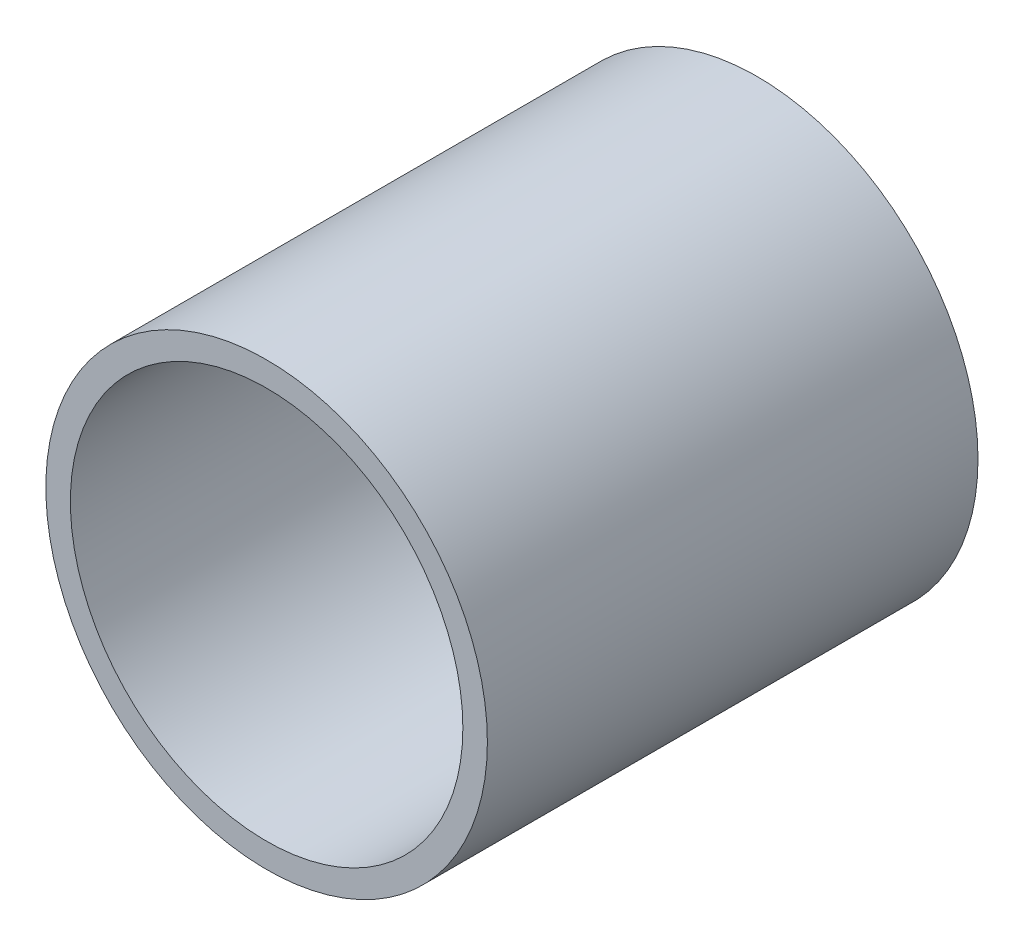
ISO-10303-21;
HEADER;
FILE_DESCRIPTION(('STEP AP214'),'2;1');
FILE_NAME('part.step','',(''),(''),'','','');
FILE_SCHEMA(('AUTOMOTIVE_DESIGN { 1 0 10303 214 1 1 1 1 }'));
ENDSEC;
DATA;
#1=APPLICATION_CONTEXT('core data for automotive mechanical design processes');
#2=APPLICATION_PROTOCOL_DEFINITION('international standard','automotive_design',2000,#1);
#3=PRODUCT_CONTEXT('',#1,'mechanical');
#4=PRODUCT('Part','Part','',(#3));
#5=PRODUCT_RELATED_PRODUCT_CATEGORY('part','',(#4));
#6=PRODUCT_DEFINITION_FORMATION('','',#4);
#7=PRODUCT_DEFINITION_CONTEXT('part definition',#1,'design');
#8=PRODUCT_DEFINITION('design','',#6,#7);
#9=PRODUCT_DEFINITION_SHAPE('','',#8);
#10=(LENGTH_UNIT() NAMED_UNIT(*) SI_UNIT(.MILLI.,.METRE.));
#11=(NAMED_UNIT(*) PLANE_ANGLE_UNIT() SI_UNIT($,.RADIAN.));
#12=(NAMED_UNIT(*) SI_UNIT($,.STERADIAN.) SOLID_ANGLE_UNIT());
#13=UNCERTAINTY_MEASURE_WITH_UNIT(LENGTH_MEASURE(1.E-05),#10,'distance_accuracy_value','');
#14=(GEOMETRIC_REPRESENTATION_CONTEXT(3) GLOBAL_UNCERTAINTY_ASSIGNED_CONTEXT((#13)) GLOBAL_UNIT_ASSIGNED_CONTEXT((#10,
#11,#12)) REPRESENTATION_CONTEXT('',''));
#15=CARTESIAN_POINT('',(0.,0.,0.));
#16=DIRECTION('',(0.,0.,1.));
#17=DIRECTION('',(1.,0.,0.));
#18=AXIS2_PLACEMENT_3D('',#15,#16,#17);
#19=CARTESIAN_POINT('',(0.,0.,40.));
#20=DIRECTION('',(0.,0.,-1.));
#21=DIRECTION('',(-1.,0.,0.));
#22=AXIS2_PLACEMENT_3D('',#19,#20,#21);
#23=CYLINDRICAL_SURFACE('',#22,16.);
#24=CARTESIAN_POINT('',(0.,0.,40.));
#25=DIRECTION('',(0.,0.,1.));
#26=DIRECTION('',(1.,0.,0.));
#27=AXIS2_PLACEMENT_3D('',#24,#25,#26);
#28=CIRCLE('',#27,16.);
#29=CARTESIAN_POINT('',(16.,0.,40.));
#30=VERTEX_POINT('',#29);
#31=EDGE_CURVE('E48',#30,#30,#28,.T.);
#32=ORIENTED_EDGE('',*,*,#31,.T.);
#33=EDGE_LOOP('',(#32));
#34=FACE_BOUND('',#33,.T.);
#35=CARTESIAN_POINT('',(0.,0.,0.));
#36=DIRECTION('',(0.,0.,1.));
#37=DIRECTION('',(1.,0.,0.));
#38=AXIS2_PLACEMENT_3D('',#35,#36,#37);
#39=CIRCLE('',#38,16.);
#40=CARTESIAN_POINT('',(16.,0.,0.));
#41=VERTEX_POINT('',#40);
#42=EDGE_CURVE('E54',#41,#41,#39,.T.);
#43=ORIENTED_EDGE('',*,*,#42,.F.);
#44=EDGE_LOOP('',(#43));
#45=FACE_BOUND('',#44,.T.);
#46=ADVANCED_FACE('F41',(#34,#45),#23,.F.);
#47=CARTESIAN_POINT('',(0.,0.,40.));
#48=DIRECTION('',(0.,0.,-1.));
#49=DIRECTION('',(-1.,0.,0.));
#50=AXIS2_PLACEMENT_3D('',#47,#48,#49);
#51=CYLINDRICAL_SURFACE('',#50,18.);
#52=CARTESIAN_POINT('',(0.,0.,40.));
#53=DIRECTION('',(0.,0.,1.));
#54=DIRECTION('',(1.,0.,0.));
#55=AXIS2_PLACEMENT_3D('',#52,#53,#54);
#56=CIRCLE('',#55,18.);
#57=CARTESIAN_POINT('',(18.,0.,40.));
#58=VERTEX_POINT('',#57);
#59=EDGE_CURVE('E10',#58,#58,#56,.T.);
#60=ORIENTED_EDGE('',*,*,#59,.F.);
#61=EDGE_LOOP('',(#60));
#62=FACE_BOUND('',#61,.T.);
#63=CARTESIAN_POINT('',(0.,0.,0.));
#64=DIRECTION('',(0.,0.,1.));
#65=DIRECTION('',(1.,0.,0.));
#66=AXIS2_PLACEMENT_3D('',#63,#64,#65);
#67=CIRCLE('',#66,18.);
#68=CARTESIAN_POINT('',(18.,0.,0.));
#69=VERTEX_POINT('',#68);
#70=EDGE_CURVE('E44',#69,#69,#67,.T.);
#71=ORIENTED_EDGE('',*,*,#70,.T.);
#72=EDGE_LOOP('',(#71));
#73=FACE_BOUND('',#72,.T.);
#74=ADVANCED_FACE('F61',(#62,#73),#51,.T.);
#75=CARTESIAN_POINT('',(0.,0.,40.));
#76=DIRECTION('',(0.,0.,1.));
#77=DIRECTION('',(1.,0.,0.));
#78=AXIS2_PLACEMENT_3D('',#75,#76,#77);
#79=PLANE('',#78);
#80=ORIENTED_EDGE('',*,*,#31,.F.);
#81=EDGE_LOOP('',(#80));
#82=FACE_BOUND('',#81,.T.);
#83=ORIENTED_EDGE('',*,*,#59,.T.);
#84=EDGE_LOOP('',(#83));
#85=FACE_BOUND('',#84,.T.);
#86=ADVANCED_FACE('F65',(#82,#85),#79,.T.);
#87=CARTESIAN_POINT('',(0.,0.,0.));
#88=DIRECTION('',(0.,0.,1.));
#89=DIRECTION('',(1.,0.,0.));
#90=AXIS2_PLACEMENT_3D('',#87,#88,#89);
#91=PLANE('',#90);
#92=ORIENTED_EDGE('',*,*,#42,.T.);
#93=EDGE_LOOP('',(#92));
#94=FACE_BOUND('',#93,.T.);
#95=ORIENTED_EDGE('',*,*,#70,.F.);
#96=EDGE_LOOP('',(#95));
#97=FACE_BOUND('',#96,.T.);
#98=ADVANCED_FACE('F63',(#94,#97),#91,.F.);
#99=CLOSED_SHELL('',(#46,#74,#86,#98));
#100=MANIFOLD_SOLID_BREP('B2',#99);
#101=ADVANCED_BREP_SHAPE_REPRESENTATION('',(#18,#100),#14);
#102=SHAPE_DEFINITION_REPRESENTATION(#9,#101);
ENDSEC;
END-ISO-10303-21;
